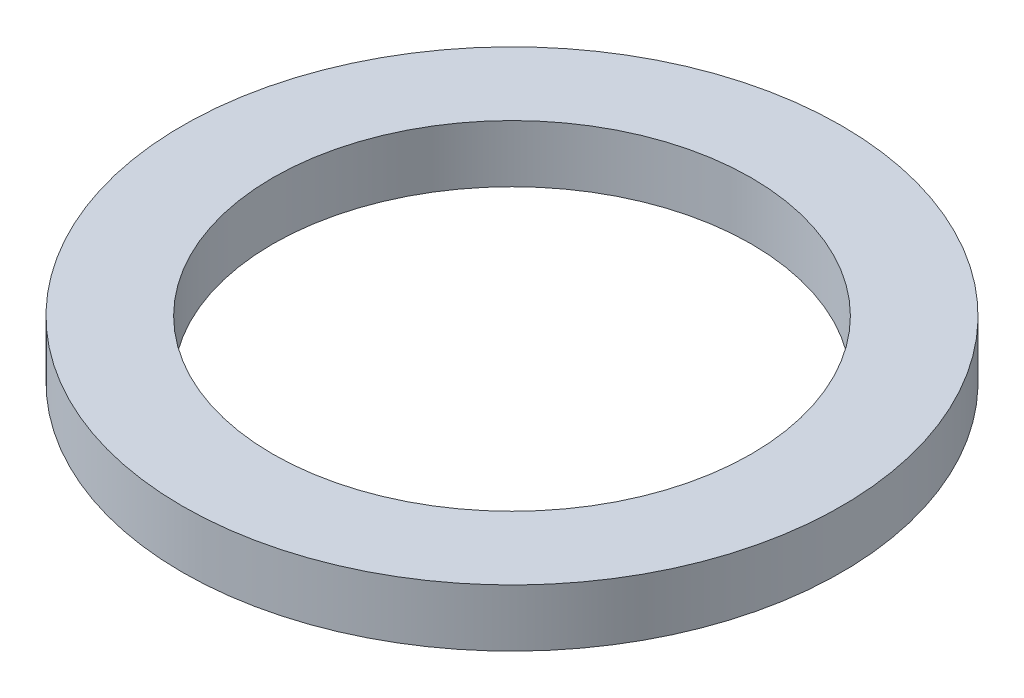
ISO-10303-21;
HEADER;
FILE_DESCRIPTION(('STEP AP214'),'2;1');
FILE_NAME('part.step','',(''),(''),'','','');
FILE_SCHEMA(('AUTOMOTIVE_DESIGN { 1 0 10303 214 1 1 1 1 }'));
ENDSEC;
DATA;
#1=APPLICATION_CONTEXT('core data for automotive mechanical design processes');
#2=APPLICATION_PROTOCOL_DEFINITION('international standard','automotive_design',2000,#1);
#3=PRODUCT_CONTEXT('',#1,'mechanical');
#4=PRODUCT('Part','Part','',(#3));
#5=PRODUCT_RELATED_PRODUCT_CATEGORY('part','',(#4));
#6=PRODUCT_DEFINITION_FORMATION('','',#4);
#7=PRODUCT_DEFINITION_CONTEXT('part definition',#1,'design');
#8=PRODUCT_DEFINITION('design','',#6,#7);
#9=PRODUCT_DEFINITION_SHAPE('','',#8);
#10=(LENGTH_UNIT() NAMED_UNIT(*) SI_UNIT(.MILLI.,.METRE.));
#11=(NAMED_UNIT(*) PLANE_ANGLE_UNIT() SI_UNIT($,.RADIAN.));
#12=(NAMED_UNIT(*) SI_UNIT($,.STERADIAN.) SOLID_ANGLE_UNIT());
#13=UNCERTAINTY_MEASURE_WITH_UNIT(LENGTH_MEASURE(1.E-05),#10,'distance_accuracy_value','');
#14=(GEOMETRIC_REPRESENTATION_CONTEXT(3) GLOBAL_UNCERTAINTY_ASSIGNED_CONTEXT((#13)) GLOBAL_UNIT_ASSIGNED_CONTEXT((#10,
#11,#12)) REPRESENTATION_CONTEXT('',''));
#15=CARTESIAN_POINT('',(0.,0.,0.));
#16=DIRECTION('',(0.,0.,1.));
#17=DIRECTION('',(1.,0.,0.));
#18=AXIS2_PLACEMENT_3D('',#15,#16,#17);
#19=CARTESIAN_POINT('',(0.,4.,0.));
#20=DIRECTION('',(0.,1.,0.));
#21=DIRECTION('',(0.,0.,1.));
#22=AXIS2_PLACEMENT_3D('',#19,#20,#21);
#23=PLANE('',#22);
#24=CARTESIAN_POINT('',(0.,4.,0.));
#25=DIRECTION('',(0.,1.,0.));
#26=DIRECTION('',(0.,0.,1.));
#27=AXIS2_PLACEMENT_3D('',#24,#25,#26);
#28=CIRCLE('',#27,23.);
#29=CARTESIAN_POINT('',(0.,4.,23.));
#30=VERTEX_POINT('',#29);
#31=EDGE_CURVE('E10',#30,#30,#28,.T.);
#32=ORIENTED_EDGE('',*,*,#31,.T.);
#33=EDGE_LOOP('',(#32));
#34=FACE_BOUND('',#33,.T.);
#35=CARTESIAN_POINT('',(0.,4.,0.));
#36=DIRECTION('',(0.,1.,0.));
#37=DIRECTION('',(0.,0.,1.));
#38=AXIS2_PLACEMENT_3D('',#35,#36,#37);
#39=CIRCLE('',#38,16.7);
#40=CARTESIAN_POINT('',(0.,4.,16.7));
#41=VERTEX_POINT('',#40);
#42=EDGE_CURVE('E41',#41,#41,#39,.T.);
#43=ORIENTED_EDGE('',*,*,#42,.F.);
#44=EDGE_LOOP('',(#43));
#45=FACE_BOUND('',#44,.T.);
#46=ADVANCED_FACE('F30',(#34,#45),#23,.T.);
#47=CARTESIAN_POINT('',(0.,0.,0.));
#48=DIRECTION('',(0.,1.,0.));
#49=DIRECTION('',(0.,0.,1.));
#50=AXIS2_PLACEMENT_3D('',#47,#48,#49);
#51=PLANE('',#50);
#52=CARTESIAN_POINT('',(0.,0.,0.));
#53=DIRECTION('',(0.,1.,0.));
#54=DIRECTION('',(0.,0.,1.));
#55=AXIS2_PLACEMENT_3D('',#52,#53,#54);
#56=CIRCLE('',#55,23.);
#57=CARTESIAN_POINT('',(0.,0.,23.));
#58=VERTEX_POINT('',#57);
#59=EDGE_CURVE('E34',#58,#58,#56,.T.);
#60=ORIENTED_EDGE('',*,*,#59,.F.);
#61=EDGE_LOOP('',(#60));
#62=FACE_BOUND('',#61,.T.);
#63=CARTESIAN_POINT('',(0.,0.,0.));
#64=DIRECTION('',(0.,1.,0.));
#65=DIRECTION('',(0.,0.,1.));
#66=AXIS2_PLACEMENT_3D('',#63,#64,#65);
#67=CIRCLE('',#66,16.7);
#68=CARTESIAN_POINT('',(0.,0.,16.7));
#69=VERTEX_POINT('',#68);
#70=EDGE_CURVE('E43',#69,#69,#67,.T.);
#71=ORIENTED_EDGE('',*,*,#70,.T.);
#72=EDGE_LOOP('',(#71));
#73=FACE_BOUND('',#72,.T.);
#74=ADVANCED_FACE('F53',(#62,#73),#51,.F.);
#75=CARTESIAN_POINT('',(0.,4.,0.));
#76=DIRECTION('',(0.,-1.,0.));
#77=DIRECTION('',(0.,0.,-1.));
#78=AXIS2_PLACEMENT_3D('',#75,#76,#77);
#79=CYLINDRICAL_SURFACE('',#78,23.);
#80=ORIENTED_EDGE('',*,*,#31,.F.);
#81=EDGE_LOOP('',(#80));
#82=FACE_BOUND('',#81,.T.);
#83=ORIENTED_EDGE('',*,*,#59,.T.);
#84=EDGE_LOOP('',(#83));
#85=FACE_BOUND('',#84,.T.);
#86=ADVANCED_FACE('F32',(#82,#85),#79,.T.);
#87=CARTESIAN_POINT('',(0.,4.,0.));
#88=DIRECTION('',(0.,-1.,0.));
#89=DIRECTION('',(0.,0.,-1.));
#90=AXIS2_PLACEMENT_3D('',#87,#88,#89);
#91=CYLINDRICAL_SURFACE('',#90,16.7);
#92=ORIENTED_EDGE('',*,*,#42,.T.);
#93=EDGE_LOOP('',(#92));
#94=FACE_BOUND('',#93,.T.);
#95=ORIENTED_EDGE('',*,*,#70,.F.);
#96=EDGE_LOOP('',(#95));
#97=FACE_BOUND('',#96,.T.);
#98=ADVANCED_FACE('F49',(#94,#97),#91,.F.);
#99=CLOSED_SHELL('',(#46,#74,#86,#98));
#100=MANIFOLD_SOLID_BREP('B2',#99);
#101=ADVANCED_BREP_SHAPE_REPRESENTATION('',(#18,#100),#14);
#102=SHAPE_DEFINITION_REPRESENTATION(#9,#101);
ENDSEC;
END-ISO-10303-21;
